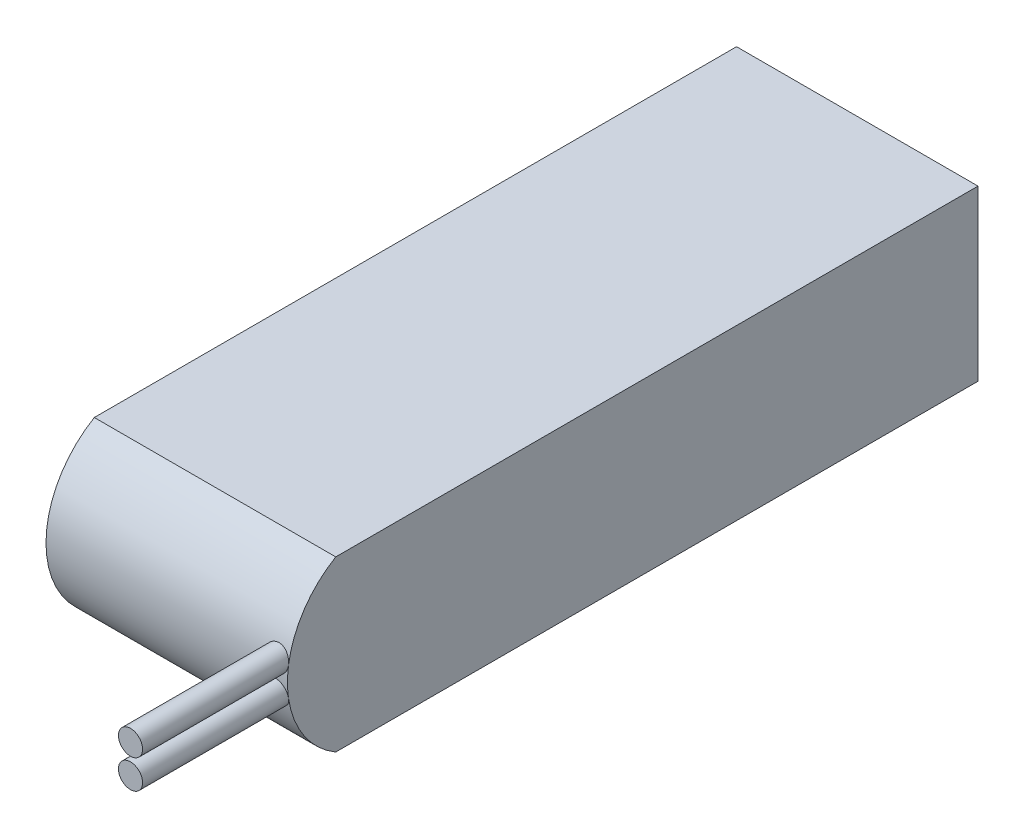
ISO-10303-21;
HEADER;
FILE_DESCRIPTION(('STEP AP214'),'2;1');
FILE_NAME('part.step','',(''),(''),'','','');
FILE_SCHEMA(('AUTOMOTIVE_DESIGN { 1 0 10303 214 1 1 1 1 }'));
ENDSEC;
DATA;
#1=APPLICATION_CONTEXT('core data for automotive mechanical design processes');
#2=APPLICATION_PROTOCOL_DEFINITION('international standard','automotive_design',2000,#1);
#3=PRODUCT_CONTEXT('',#1,'mechanical');
#4=PRODUCT('Part','Part','',(#3));
#5=PRODUCT_RELATED_PRODUCT_CATEGORY('part','',(#4));
#6=PRODUCT_DEFINITION_FORMATION('','',#4);
#7=PRODUCT_DEFINITION_CONTEXT('part definition',#1,'design');
#8=PRODUCT_DEFINITION('design','',#6,#7);
#9=PRODUCT_DEFINITION_SHAPE('','',#8);
#10=(LENGTH_UNIT() NAMED_UNIT(*) SI_UNIT(.MILLI.,.METRE.));
#11=(NAMED_UNIT(*) PLANE_ANGLE_UNIT() SI_UNIT($,.RADIAN.));
#12=(NAMED_UNIT(*) SI_UNIT($,.STERADIAN.) SOLID_ANGLE_UNIT());
#13=UNCERTAINTY_MEASURE_WITH_UNIT(LENGTH_MEASURE(1.E-05),#10,'distance_accuracy_value','');
#14=(GEOMETRIC_REPRESENTATION_CONTEXT(3) GLOBAL_UNCERTAINTY_ASSIGNED_CONTEXT((#13)) GLOBAL_UNIT_ASSIGNED_CONTEXT((#10,
#11,#12)) REPRESENTATION_CONTEXT('',''));
#15=CARTESIAN_POINT('',(0.,0.,0.));
#16=DIRECTION('',(0.,0.,1.));
#17=DIRECTION('',(1.,0.,0.));
#18=AXIS2_PLACEMENT_3D('',#15,#16,#17);
#19=CARTESIAN_POINT('',(0.,0.,133.));
#20=DIRECTION('',(1.,0.,0.));
#21=DIRECTION('',(0.,0.,-1.));
#22=AXIS2_PLACEMENT_3D('',#19,#20,#21);
#23=PLANE('',#22);
#24=DIRECTION('',(0.,-1.,0.));
#25=VECTOR('',#24,1.);
#26=CARTESIAN_POINT('',(0.,0.,0.));
#27=LINE('',#26,#25);
#28=CARTESIAN_POINT('',(0.,35.,0.));
#29=VERTEX_POINT('',#28);
#30=CARTESIAN_POINT('',(0.,0.,0.));
#31=VERTEX_POINT('',#30);
#32=EDGE_CURVE('E112',#29,#31,#27,.T.);
#33=ORIENTED_EDGE('',*,*,#32,.T.);
#34=DIRECTION('',(0.,0.,-1.));
#35=VECTOR('',#34,1.);
#36=CARTESIAN_POINT('',(0.,0.,133.));
#37=LINE('',#36,#35);
#38=CARTESIAN_POINT('',(0.,0.,133.));
#39=VERTEX_POINT('',#38);
#40=EDGE_CURVE('E138',#39,#31,#37,.T.);
#41=ORIENTED_EDGE('',*,*,#40,.F.);
#42=CARTESIAN_POINT('',(0.,17.5,122.6875));
#43=DIRECTION('',(1.,0.,0.));
#44=DIRECTION('',(0.,0.,-1.));
#45=AXIS2_PLACEMENT_3D('',#42,#43,#44);
#46=CIRCLE('',#45,20.3125);
#47=CARTESIAN_POINT('',(0.,35.,133.));
#48=VERTEX_POINT('',#47);
#49=EDGE_CURVE('E111',#48,#39,#46,.T.);
#50=ORIENTED_EDGE('',*,*,#49,.F.);
#51=DIRECTION('',(0.,0.,-1.));
#52=VECTOR('',#51,1.);
#53=CARTESIAN_POINT('',(0.,35.,133.));
#54=LINE('',#53,#52);
#55=EDGE_CURVE('E55',#48,#29,#54,.T.);
#56=ORIENTED_EDGE('',*,*,#55,.T.);
#57=EDGE_LOOP('',(#33,#41,#50,#56));
#58=FACE_BOUND('',#57,.T.);
#59=ADVANCED_FACE('F34',(#58),#23,.F.);
#60=CARTESIAN_POINT('',(0.,0.,133.));
#61=DIRECTION('',(0.,1.,0.));
#62=DIRECTION('',(0.,0.,1.));
#63=AXIS2_PLACEMENT_3D('',#60,#61,#62);
#64=PLANE('',#63);
#65=DIRECTION('',(1.,0.,0.));
#66=VECTOR('',#65,1.);
#67=CARTESIAN_POINT('',(0.,0.,0.));
#68=LINE('',#67,#66);
#69=CARTESIAN_POINT('',(50.,0.,0.));
#70=VERTEX_POINT('',#69);
#71=EDGE_CURVE('E115',#31,#70,#68,.T.);
#72=ORIENTED_EDGE('',*,*,#71,.T.);
#73=DIRECTION('',(0.,0.,-1.));
#74=VECTOR('',#73,1.);
#75=CARTESIAN_POINT('',(50.,0.,133.));
#76=LINE('',#75,#74);
#77=CARTESIAN_POINT('',(50.,0.,133.));
#78=VERTEX_POINT('',#77);
#79=EDGE_CURVE('E142',#78,#70,#76,.T.);
#80=ORIENTED_EDGE('',*,*,#79,.F.);
#81=DIRECTION('',(1.,0.,0.));
#82=VECTOR('',#81,1.);
#83=CARTESIAN_POINT('',(0.,0.,133.));
#84=LINE('',#83,#82);
#85=EDGE_CURVE('E83',#39,#78,#84,.T.);
#86=ORIENTED_EDGE('',*,*,#85,.F.);
#87=ORIENTED_EDGE('',*,*,#40,.T.);
#88=EDGE_LOOP('',(#72,#80,#86,#87));
#89=FACE_BOUND('',#88,.T.);
#90=ADVANCED_FACE('F132',(#89),#64,.F.);
#91=CARTESIAN_POINT('',(50.,0.,133.));
#92=DIRECTION('',(-1.,0.,0.));
#93=DIRECTION('',(0.,0.,1.));
#94=AXIS2_PLACEMENT_3D('',#91,#92,#93);
#95=PLANE('',#94);
#96=CARTESIAN_POINT('',(50.,17.5,122.6875));
#97=DIRECTION('',(1.,0.,0.));
#98=DIRECTION('',(0.,0.,-1.));
#99=AXIS2_PLACEMENT_3D('',#96,#97,#98);
#100=CIRCLE('',#99,20.3125);
#101=CARTESIAN_POINT('',(50.,20.5,142.777240074227));
#102=VERTEX_POINT('',#101);
#103=CARTESIAN_POINT('',(50.,14.5,142.777240074227));
#104=VERTEX_POINT('',#103);
#105=EDGE_CURVE('E93',#102,#104,#100,.T.);
#106=ORIENTED_EDGE('',*,*,#105,.T.);
#107=EDGE_CURVE('E96',#104,#78,#100,.T.);
#108=ORIENTED_EDGE('',*,*,#107,.T.);
#109=ORIENTED_EDGE('',*,*,#79,.T.);
#110=DIRECTION('',(0.,1.,0.));
#111=VECTOR('',#110,1.);
#112=CARTESIAN_POINT('',(50.,0.,0.));
#113=LINE('',#112,#111);
#114=CARTESIAN_POINT('',(50.,35.,0.));
#115=VERTEX_POINT('',#114);
#116=EDGE_CURVE('E74',#70,#115,#113,.T.);
#117=ORIENTED_EDGE('',*,*,#116,.T.);
#118=DIRECTION('',(0.,0.,-1.));
#119=VECTOR('',#118,1.);
#120=CARTESIAN_POINT('',(50.,35.,133.));
#121=LINE('',#120,#119);
#122=CARTESIAN_POINT('',(50.,35.,133.));
#123=VERTEX_POINT('',#122);
#124=EDGE_CURVE('E145',#123,#115,#121,.T.);
#125=ORIENTED_EDGE('',*,*,#124,.F.);
#126=EDGE_CURVE('E98',#123,#102,#100,.T.);
#127=ORIENTED_EDGE('',*,*,#126,.T.);
#128=EDGE_LOOP('',(#106,#108,#109,#117,#125,#127));
#129=FACE_BOUND('',#128,.T.);
#130=ADVANCED_FACE('F95',(#129),#95,.F.);
#131=CARTESIAN_POINT('',(0.,35.,133.));
#132=DIRECTION('',(0.,-1.,0.));
#133=DIRECTION('',(0.,0.,-1.));
#134=AXIS2_PLACEMENT_3D('',#131,#132,#133);
#135=PLANE('',#134);
#136=DIRECTION('',(-1.,0.,0.));
#137=VECTOR('',#136,1.);
#138=CARTESIAN_POINT('',(0.,35.,0.));
#139=LINE('',#138,#137);
#140=EDGE_CURVE('E77',#115,#29,#139,.T.);
#141=ORIENTED_EDGE('',*,*,#140,.T.);
#142=ORIENTED_EDGE('',*,*,#55,.F.);
#143=DIRECTION('',(-1.,0.,0.));
#144=VECTOR('',#143,1.);
#145=CARTESIAN_POINT('',(0.,35.,133.));
#146=LINE('',#145,#144);
#147=EDGE_CURVE('E248',#123,#48,#146,.T.);
#148=ORIENTED_EDGE('',*,*,#147,.F.);
#149=ORIENTED_EDGE('',*,*,#124,.T.);
#150=EDGE_LOOP('',(#141,#142,#148,#149));
#151=FACE_BOUND('',#150,.T.);
#152=ADVANCED_FACE('F198',(#151),#135,.F.);
#153=CARTESIAN_POINT('',(0.,0.,0.));
#154=DIRECTION('',(0.,0.,-1.));
#155=DIRECTION('',(-1.,0.,0.));
#156=AXIS2_PLACEMENT_3D('',#153,#154,#155);
#157=PLANE('',#156);
#158=ORIENTED_EDGE('',*,*,#140,.F.);
#159=ORIENTED_EDGE('',*,*,#116,.F.);
#160=ORIENTED_EDGE('',*,*,#71,.F.);
#161=ORIENTED_EDGE('',*,*,#32,.F.);
#162=EDGE_LOOP('',(#158,#159,#160,#161));
#163=FACE_BOUND('',#162,.T.);
#164=ADVANCED_FACE('F140',(#163),#157,.T.);
#165=CARTESIAN_POINT('',(0.,17.5,122.6875));
#166=DIRECTION('',(1.,0.,0.));
#167=DIRECTION('',(0.,0.,-1.));
#168=AXIS2_PLACEMENT_3D('',#165,#166,#167);
#169=CYLINDRICAL_SURFACE('',#168,20.3125);
#170=ORIENTED_EDGE('',*,*,#107,.F.);
#171=CARTESIAN_POINT('',(45.,14.5,142.777240074227));
#172=CARTESIAN_POINT('',(45.0000062171371,14.3573785754829,142.755940210344));
#173=CARTESIAN_POINT('',(45.0122448255712,14.2148870318114,142.733094790593));
#174=CARTESIAN_POINT('',(45.0606726678996,13.9343144773865,142.685096705599));
#175=CARTESIAN_POINT('',(45.0968922056615,13.7962392791442,142.659941155811));
#176=CARTESIAN_POINT('',(45.1920894650846,13.5285573495319,142.608440227862));
#177=CARTESIAN_POINT('',(45.2510449137297,13.3989424749386,142.582096036376));
#178=CARTESIAN_POINT('',(45.3900471548066,13.1515837766608,142.529499418776));
#179=CARTESIAN_POINT('',(45.4700896973068,13.0338375675474,142.503246975251));
#180=CARTESIAN_POINT('',(45.6498158743172,12.8126139190982,142.452091269095));
#181=CARTESIAN_POINT('',(45.7496364024011,12.7092449969693,142.427199046671));
#182=CARTESIAN_POINT('',(45.9659227307446,12.5208149249459,142.380514477588));
#183=CARTESIAN_POINT('',(46.0823881484652,12.4357533544176,142.358722059711));
#184=CARTESIAN_POINT('',(46.3270127698465,12.2877059051862,142.320009772618));
#185=CARTESIAN_POINT('',(46.4549803434858,12.2244209635967,142.303024514699));
#186=CARTESIAN_POINT('',(46.7203629371228,12.120406873944,142.274755121742));
#187=CARTESIAN_POINT('',(46.8577757138659,12.0796723907674,142.263469638275));
#188=CARTESIAN_POINT('',(47.1332644634722,12.0231833217126,142.247739579397));
#189=CARTESIAN_POINT('',(47.2711681061626,12.0066469241362,142.243081042108));
#190=CARTESIAN_POINT('',(47.5478668683483,11.9966289828726,142.240264413829));
#191=CARTESIAN_POINT('',(47.686661853681,12.0031440471287,142.242105366429));
#192=CARTESIAN_POINT('',(47.9581250482023,12.0386044380775,142.252037638973));
#193=CARTESIAN_POINT('',(48.0908607334774,12.0670740831736,142.259996395214));
#194=CARTESIAN_POINT('',(48.3495791701101,12.1449061920865,142.281433815524));
#195=CARTESIAN_POINT('',(48.4755615824154,12.1942697037877,142.294912756445));
#196=CARTESIAN_POINT('',(48.7189098332363,12.3130364692511,142.326666729343));
#197=CARTESIAN_POINT('',(48.8361552844647,12.3826712213147,142.344996929784));
#198=CARTESIAN_POINT('',(49.0574136134029,12.5396751597681,142.385199963911));
#199=CARTESIAN_POINT('',(49.1614243090291,12.6270472644609,142.407073380436));
#200=CARTESIAN_POINT('',(49.3568488329367,12.8202392369301,142.453826615033));
#201=CARTESIAN_POINT('',(49.4477436908885,12.9265661794539,142.47878101368));
#202=CARTESIAN_POINT('',(49.6104992267075,13.1527037023149,142.529679586638));
#203=CARTESIAN_POINT('',(49.6823571349767,13.2725162410005,142.555623904339));
#204=CARTESIAN_POINT('',(49.8066274966835,13.5254330209203,142.607778885726));
#205=CARTESIAN_POINT('',(49.8585430013911,13.6587835503581,142.633981468386));
#206=CARTESIAN_POINT('',(49.9389548133426,13.9326658762543,142.684779038144));
#207=CARTESIAN_POINT('',(49.967451094496,14.0731976807129,142.709374023453));
#208=CARTESIAN_POINT('',(50.0000046857137,14.3572558843604,142.755920122726));
#209=CARTESIAN_POINT('',(50.0041036599194,14.5007767580267,142.777875681252));
#210=CARTESIAN_POINT('',(49.9876157880519,14.7868635625395,142.818506342414));
#211=CARTESIAN_POINT('',(49.9670313665373,14.9294295857943,142.837181767038));
#212=CARTESIAN_POINT('',(49.9021212428141,15.2069500626175,142.87063151409));
#213=CARTESIAN_POINT('',(49.8582024108532,15.3419924063878,142.885466399607));
#214=CARTESIAN_POINT('',(49.7479975006429,15.6029812119353,142.911648661936));
#215=CARTESIAN_POINT('',(49.6817130432909,15.7289283320652,142.922996291367));
#216=CARTESIAN_POINT('',(49.5296129730833,15.9663891746636,142.942369233267));
#217=CARTESIAN_POINT('',(49.4440604709534,16.0780681967132,142.950435533583));
#218=CARTESIAN_POINT('',(49.2553627978917,16.2856005559973,142.963932771429));
#219=CARTESIAN_POINT('',(49.1522178893642,16.3814541292386,142.969363748262));
#220=CARTESIAN_POINT('',(48.9315450633418,16.5543312012672,142.97815949993));
#221=CARTESIAN_POINT('',(48.8140537661405,16.6314011984683,142.981529408806));
#222=CARTESIAN_POINT('',(48.567810759473,16.7648155138456,142.986801375805));
#223=CARTESIAN_POINT('',(48.439058963565,16.8211596729013,142.98870342266));
#224=CARTESIAN_POINT('',(48.1736694974167,16.9116098111899,142.991527174976));
#225=CARTESIAN_POINT('',(48.0370165717781,16.9456710927802,142.992446912326));
#226=CARTESIAN_POINT('',(47.7599316063347,16.9904076749674,142.993619272163));
#227=CARTESIAN_POINT('',(47.6194995328583,17.0010827671279,142.993871888704));
#228=CARTESIAN_POINT('',(47.338663912817,16.9987422028554,142.993814243946));
#229=CARTESIAN_POINT('',(47.1982606023219,16.9856981271234,142.993503307423));
#230=CARTESIAN_POINT('',(46.9216361481704,16.9362342444362,142.992189806752));
#231=CARTESIAN_POINT('',(46.7854150288808,16.8998143013132,142.991187238577));
#232=CARTESIAN_POINT('',(46.5210204299396,16.8046345659691,142.988149626608));
#233=CARTESIAN_POINT('',(46.3928472449011,16.745873956472,142.986114545043));
#234=CARTESIAN_POINT('',(46.1482070628945,16.6076976902218,142.980508959222));
#235=CARTESIAN_POINT('',(46.0317395700402,16.5282829089499,142.976938520041));
#236=CARTESIAN_POINT('',(45.813964003836,16.3512034083815,142.967681231588));
#237=CARTESIAN_POINT('',(45.7126368565887,16.253562006121,142.961997077241));
#238=CARTESIAN_POINT('',(45.527821418756,16.0427762683755,142.947936477252));
#239=CARTESIAN_POINT('',(45.4443365317103,15.9296289817753,142.9395595187));
#240=CARTESIAN_POINT('',(45.2976892681049,15.691373829249,142.91967201739));
#241=CARTESIAN_POINT('',(45.2344939616205,15.5662857757034,142.908166608736));
#242=CARTESIAN_POINT('',(45.1299831895213,15.30772809293,142.881767061768));
#243=CARTESIAN_POINT('',(45.0886443567158,15.1742675863842,142.866876566981));
#244=CARTESIAN_POINT('',(45.0391663322746,14.9500449915776,142.839507041553));
#245=CARTESIAN_POINT('',(45.0244829289179,14.8605531083049,142.827986833524));
#246=CARTESIAN_POINT('',(45.0048978169166,14.6806901181124,142.803597714686));
#247=CARTESIAN_POINT('',(44.9999960628236,14.5903190152797,142.790728810145));
#248=CARTESIAN_POINT('',(45.,14.5,142.777240074227));
#249=B_SPLINE_CURVE_WITH_KNOTS('',3,(#171,#172,#173,#174,#175,#176,#177,#178,#179,#180,#181,
#182,#183,#184,#185,#186,#187,#188,#189,#190,#191,#192,#193,#194,#195,#196,#197,#198,#199,#200,
#201,#202,#203,#204,#205,#206,#207,#208,#209,#210,#211,#212,#213,#214,#215,#216,#217,#218,#219,
#220,#221,#222,#223,#224,#225,#226,#227,#228,#229,#230,#231,#232,#233,#234,#235,#236,#237,#238,
#239,#240,#241,#242,#243,#244,#245,#246,#247,#248),.UNSPECIFIED.,.T.,.F.,(4,2,2,2,2,2,2,2,2,2,2,
2,2,2,2,2,2,2,2,2,2,2,2,2,2,2,2,2,2,2,2,2,2,2,2,2,2,2,4),(0.,0.432271581736891,
0.865090455281744,1.2974863946787,1.7297952547817,2.16520802045301,2.60061078091882,
3.02977010632354,3.45882785537697,3.87369137509875,4.28849384957598,4.69455308098031,
5.10063267977712,5.51154496456953,5.92252491108441,6.34685556629642,6.7712479215601,
7.20561901991374,7.63999060218175,8.07362017946334,8.50720716640536,8.93347072975343,
9.35970340726004,9.78043510630617,10.201160530366,10.6208336293094,11.0405099501826,
11.4610255472168,11.8815448922075,12.3025684176394,12.7235943956142,13.1446357772292,
13.5656593148111,13.986147889492,14.4067166039471,14.8265992451124,15.2460320689891,
15.5197814382103,15.7935295355111),.UNSPECIFIED.);
#250=EDGE_CURVE('E11',#104,#104,#249,.T.);
#251=ORIENTED_EDGE('',*,*,#250,.F.);
#252=ORIENTED_EDGE('',*,*,#105,.F.);
#253=CARTESIAN_POINT('',(50.,20.5,142.777240074227));
#254=CARTESIAN_POINT('',(49.9999937828629,20.6426214245171,142.755940210344));
#255=CARTESIAN_POINT('',(49.9877551744288,20.7851129681886,142.733094790593));
#256=CARTESIAN_POINT('',(49.9393273321004,21.0656855226135,142.685096705599));
#257=CARTESIAN_POINT('',(49.9031077943385,21.2037607208558,142.659941155811));
#258=CARTESIAN_POINT('',(49.8079105349154,21.4714426504681,142.608440227862));
#259=CARTESIAN_POINT('',(49.7489550862703,21.6010575250614,142.582096036376));
#260=CARTESIAN_POINT('',(49.6099528451934,21.8484162233392,142.529499418776));
#261=CARTESIAN_POINT('',(49.5299103026932,21.9661624324526,142.503246975251));
#262=CARTESIAN_POINT('',(49.3501841256828,22.1873860809018,142.452091269095));
#263=CARTESIAN_POINT('',(49.2503635975989,22.2907550030307,142.427199046671));
#264=CARTESIAN_POINT('',(49.0340772692554,22.4791850750541,142.380514477588));
#265=CARTESIAN_POINT('',(48.9176118515348,22.5642466455824,142.35872205971));
#266=CARTESIAN_POINT('',(48.6729872301535,22.7122940948138,142.320009772618));
#267=CARTESIAN_POINT('',(48.5450196565142,22.7755790364033,142.303024514699));
#268=CARTESIAN_POINT('',(48.2796370628772,22.879593126056,142.274755121742));
#269=CARTESIAN_POINT('',(48.1422242861341,22.9203276092326,142.263469638275));
#270=CARTESIAN_POINT('',(47.8667355365278,22.9768166782874,142.247739579397));
#271=CARTESIAN_POINT('',(47.7288318938374,22.9933530758638,142.243081042108));
#272=CARTESIAN_POINT('',(47.4521331316517,23.0033710171274,142.240264413829));
#273=CARTESIAN_POINT('',(47.313338146319,22.9968559528713,142.242105366429));
#274=CARTESIAN_POINT('',(47.0418749517977,22.9613955619225,142.252037638973));
#275=CARTESIAN_POINT('',(46.9091392665225,22.9329259168264,142.259996395214));
#276=CARTESIAN_POINT('',(46.6504208298899,22.8550938079135,142.281433815524));
#277=CARTESIAN_POINT('',(46.5244384175846,22.8057302962123,142.294912756445));
#278=CARTESIAN_POINT('',(46.2810901667637,22.6869635307489,142.326666729343));
#279=CARTESIAN_POINT('',(46.1638447155353,22.6173287786853,142.344996929784));
#280=CARTESIAN_POINT('',(45.9425863865971,22.4603248402319,142.385199963911));
#281=CARTESIAN_POINT('',(45.8385756909709,22.3729527355391,142.407073380436));
#282=CARTESIAN_POINT('',(45.6431511670633,22.1797607630699,142.453826615033));
#283=CARTESIAN_POINT('',(45.5522563091115,22.0734338205461,142.47878101368));
#284=CARTESIAN_POINT('',(45.3895007732925,21.8472962976851,142.529679586638));
#285=CARTESIAN_POINT('',(45.3176428650233,21.7274837589995,142.555623904339));
#286=CARTESIAN_POINT('',(45.1933725033165,21.4745669790797,142.607778885726));
#287=CARTESIAN_POINT('',(45.1414569986089,21.3412164496419,142.633981468386));
#288=CARTESIAN_POINT('',(45.0610451866574,21.0673341237457,142.684779038144));
#289=CARTESIAN_POINT('',(45.032548905504,20.9268023192871,142.709374023453));
#290=CARTESIAN_POINT('',(44.9999953142863,20.6427441156396,142.755920122726));
#291=CARTESIAN_POINT('',(44.9958963400806,20.4992232419733,142.777875681252));
#292=CARTESIAN_POINT('',(45.0123842119481,20.2131364374605,142.818506342414));
#293=CARTESIAN_POINT('',(45.0329686334626,20.0705704142057,142.837181767038));
#294=CARTESIAN_POINT('',(45.0978787571859,19.7930499373825,142.87063151409));
#295=CARTESIAN_POINT('',(45.1417975891468,19.6580075936122,142.885466399607));
#296=CARTESIAN_POINT('',(45.2520024993571,19.3970187880647,142.911648661936));
#297=CARTESIAN_POINT('',(45.3182869567091,19.2710716679349,142.922996291367));
#298=CARTESIAN_POINT('',(45.4703870269167,19.0336108253364,142.942369233267));
#299=CARTESIAN_POINT('',(45.5559395290466,18.9219318032868,142.950435533583));
#300=CARTESIAN_POINT('',(45.7446372021083,18.7143994440027,142.963932771429));
#301=CARTESIAN_POINT('',(45.8477821106358,18.6185458707614,142.969363748262));
#302=CARTESIAN_POINT('',(46.0684549366582,18.4456687987328,142.97815949993));
#303=CARTESIAN_POINT('',(46.1859462338595,18.3685988015317,142.981529408806));
#304=CARTESIAN_POINT('',(46.4321892405269,18.2351844861544,142.986801375805));
#305=CARTESIAN_POINT('',(46.560941036435,18.1788403270987,142.98870342266));
#306=CARTESIAN_POINT('',(46.8263305025833,18.0883901888101,142.991527174976));
#307=CARTESIAN_POINT('',(46.9629834282218,18.0543289072198,142.992446912326));
#308=CARTESIAN_POINT('',(47.2400683936653,18.0095923250326,142.993619272163));
#309=CARTESIAN_POINT('',(47.3805004671417,17.9989172328721,142.993871888704));
#310=CARTESIAN_POINT('',(47.661336087183,18.0012577971446,142.993814243946));
#311=CARTESIAN_POINT('',(47.8017393976781,18.0143018728766,142.993503307423));
#312=CARTESIAN_POINT('',(48.0783638518296,18.0637657555638,142.992189806752));
#313=CARTESIAN_POINT('',(48.2145849711192,18.1001856986868,142.991187238577));
#314=CARTESIAN_POINT('',(48.4789795700604,18.1953654340309,142.988149626608));
#315=CARTESIAN_POINT('',(48.6071527550989,18.254126043528,142.986114545043));
#316=CARTESIAN_POINT('',(48.8517929371055,18.3923023097782,142.980508959222));
#317=CARTESIAN_POINT('',(48.9682604299598,18.4717170910501,142.976938520041));
#318=CARTESIAN_POINT('',(49.186035996164,18.6487965916185,142.967681231588));
#319=CARTESIAN_POINT('',(49.2873631434113,18.746437993879,142.961997077241));
#320=CARTESIAN_POINT('',(49.472178581244,18.9572237316245,142.947936477252));
#321=CARTESIAN_POINT('',(49.5556634682897,19.0703710182247,142.9395595187));
#322=CARTESIAN_POINT('',(49.7023107318951,19.308626170751,142.91967201739));
#323=CARTESIAN_POINT('',(49.7655060383795,19.4337142242966,142.908166608736));
#324=CARTESIAN_POINT('',(49.8700168104787,19.69227190707,142.881767061768));
#325=CARTESIAN_POINT('',(49.9113556432842,19.8257324136158,142.866876566981));
#326=CARTESIAN_POINT('',(49.9608336677254,20.0499550084224,142.839507041553));
#327=CARTESIAN_POINT('',(49.9755170710821,20.1394468916951,142.827986833524));
#328=CARTESIAN_POINT('',(49.9951021830834,20.3193098818876,142.803597714686));
#329=CARTESIAN_POINT('',(50.0000039371764,20.4096809847203,142.790728810145));
#330=CARTESIAN_POINT('',(50.,20.5,142.777240074227));
#331=B_SPLINE_CURVE_WITH_KNOTS('',3,(#253,#254,#255,#256,#257,#258,#259,#260,#261,#262,#263,
#264,#265,#266,#267,#268,#269,#270,#271,#272,#273,#274,#275,#276,#277,#278,#279,#280,#281,#282,
#283,#284,#285,#286,#287,#288,#289,#290,#291,#292,#293,#294,#295,#296,#297,#298,#299,#300,#301,
#302,#303,#304,#305,#306,#307,#308,#309,#310,#311,#312,#313,#314,#315,#316,#317,#318,#319,#320,
#321,#322,#323,#324,#325,#326,#327,#328,#329,#330),.UNSPECIFIED.,.T.,.F.,(4,2,2,2,2,2,2,2,2,2,2,
2,2,2,2,2,2,2,2,2,2,2,2,2,2,2,2,2,2,2,2,2,2,2,2,2,2,2,4),(0.,0.432271581736883,
0.865090455281741,1.2974863946787,1.7297952547817,2.16520802045301,2.60061078091882,
3.02977010632354,3.45882785537697,3.87369137509878,4.28849384957598,4.69455308098033,
5.10063267977712,5.51154496456953,5.92252491108441,6.34685556629642,6.77124792156009,
7.20561901991373,7.63999060218175,8.07362017946334,8.50720716640535,8.93347072975342,
9.35970340726004,9.78043510630617,10.201160530366,10.6208336293094,11.0405099501826,
11.4610255472168,11.8815448922075,12.3025684176393,12.7235943956142,13.1446357772292,
13.5656593148111,13.9861478894919,14.4067166039471,14.8265992451124,15.2460320689891,
15.5197814382103,15.7935295355111),.UNSPECIFIED.);
#332=EDGE_CURVE('E47',#102,#102,#331,.T.);
#333=ORIENTED_EDGE('',*,*,#332,.F.);
#334=ORIENTED_EDGE('',*,*,#126,.F.);
#335=ORIENTED_EDGE('',*,*,#147,.T.);
#336=ORIENTED_EDGE('',*,*,#49,.T.);
#337=ORIENTED_EDGE('',*,*,#85,.T.);
#338=EDGE_LOOP('',(#170,#251,#252,#333,#334,#335,#336,#337));
#339=FACE_BOUND('',#338,.T.);
#340=ADVANCED_FACE('F103',(#339),#169,.T.);
#341=CARTESIAN_POINT('',(47.5,20.5,173.));
#342=DIRECTION('',(0.,0.,-1.));
#343=DIRECTION('',(-1.,0.,0.));
#344=AXIS2_PLACEMENT_3D('',#341,#342,#343);
#345=CYLINDRICAL_SURFACE('',#344,2.5);
#346=ORIENTED_EDGE('',*,*,#332,.T.);
#347=EDGE_LOOP('',(#346));
#348=FACE_BOUND('',#347,.T.);
#349=CARTESIAN_POINT('',(47.5,20.5,173.));
#350=DIRECTION('',(0.,0.,-1.));
#351=DIRECTION('',(-1.,0.,0.));
#352=AXIS2_PLACEMENT_3D('',#349,#350,#351);
#353=CIRCLE('',#352,2.5);
#354=CARTESIAN_POINT('',(45.,20.5,173.));
#355=VERTEX_POINT('',#354);
#356=EDGE_CURVE('E105',#355,#355,#353,.T.);
#357=ORIENTED_EDGE('',*,*,#356,.T.);
#358=EDGE_LOOP('',(#357));
#359=FACE_BOUND('',#358,.T.);
#360=ADVANCED_FACE('F154',(#348,#359),#345,.T.);
#361=CARTESIAN_POINT('',(47.5,20.5,173.));
#362=DIRECTION('',(0.,0.,-1.));
#363=DIRECTION('',(-1.,0.,0.));
#364=AXIS2_PLACEMENT_3D('',#361,#362,#363);
#365=PLANE('',#364);
#366=ORIENTED_EDGE('',*,*,#356,.F.);
#367=EDGE_LOOP('',(#366));
#368=FACE_BOUND('',#367,.T.);
#369=ADVANCED_FACE('F129',(#368),#365,.F.);
#370=CARTESIAN_POINT('',(47.5,14.5,173.));
#371=DIRECTION('',(0.,0.,-1.));
#372=DIRECTION('',(-1.,0.,0.));
#373=AXIS2_PLACEMENT_3D('',#370,#371,#372);
#374=CYLINDRICAL_SURFACE('',#373,2.5);
#375=ORIENTED_EDGE('',*,*,#250,.T.);
#376=EDGE_LOOP('',(#375));
#377=FACE_BOUND('',#376,.T.);
#378=CARTESIAN_POINT('',(47.5,14.5,173.));
#379=DIRECTION('',(0.,0.,-1.));
#380=DIRECTION('',(-1.,0.,0.));
#381=AXIS2_PLACEMENT_3D('',#378,#379,#380);
#382=CIRCLE('',#381,2.5);
#383=CARTESIAN_POINT('',(45.,14.5,173.));
#384=VERTEX_POINT('',#383);
#385=EDGE_CURVE('E107',#384,#384,#382,.T.);
#386=ORIENTED_EDGE('',*,*,#385,.T.);
#387=EDGE_LOOP('',(#386));
#388=FACE_BOUND('',#387,.T.);
#389=ADVANCED_FACE('F121',(#377,#388),#374,.T.);
#390=CARTESIAN_POINT('',(47.5,14.5,173.));
#391=DIRECTION('',(0.,0.,-1.));
#392=DIRECTION('',(-1.,0.,0.));
#393=AXIS2_PLACEMENT_3D('',#390,#391,#392);
#394=PLANE('',#393);
#395=ORIENTED_EDGE('',*,*,#385,.F.);
#396=EDGE_LOOP('',(#395));
#397=FACE_BOUND('',#396,.T.);
#398=ADVANCED_FACE('F123',(#397),#394,.F.);
#399=CLOSED_SHELL('',(#59,#90,#130,#152,#164,#340,#360,#369,#389,#398));
#400=MANIFOLD_SOLID_BREP('B2',#399);
#401=ADVANCED_BREP_SHAPE_REPRESENTATION('',(#18,#400),#14);
#402=SHAPE_DEFINITION_REPRESENTATION(#9,#401);
ENDSEC;
END-ISO-10303-21;
